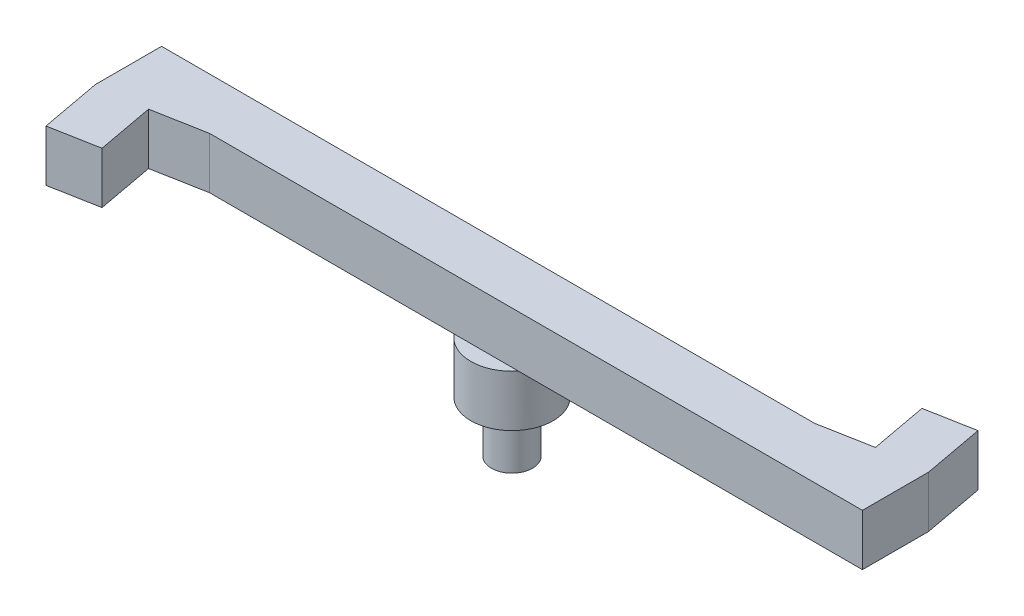
ISO-10303-21;
HEADER;
FILE_DESCRIPTION(('STEP AP214'),'2;1');
FILE_NAME('part.step','',(''),(''),'','','');
FILE_SCHEMA(('AUTOMOTIVE_DESIGN { 1 0 10303 214 1 1 1 1 }'));
ENDSEC;
DATA;
#1=APPLICATION_CONTEXT('core data for automotive mechanical design processes');
#2=APPLICATION_PROTOCOL_DEFINITION('international standard','automotive_design',2000,#1);
#3=PRODUCT_CONTEXT('',#1,'mechanical');
#4=PRODUCT('Part','Part','',(#3));
#5=PRODUCT_RELATED_PRODUCT_CATEGORY('part','',(#4));
#6=PRODUCT_DEFINITION_FORMATION('','',#4);
#7=PRODUCT_DEFINITION_CONTEXT('part definition',#1,'design');
#8=PRODUCT_DEFINITION('design','',#6,#7);
#9=PRODUCT_DEFINITION_SHAPE('','',#8);
#10=(LENGTH_UNIT() NAMED_UNIT(*) SI_UNIT(.MILLI.,.METRE.));
#11=(NAMED_UNIT(*) PLANE_ANGLE_UNIT() SI_UNIT($,.RADIAN.));
#12=(NAMED_UNIT(*) SI_UNIT($,.STERADIAN.) SOLID_ANGLE_UNIT());
#13=UNCERTAINTY_MEASURE_WITH_UNIT(LENGTH_MEASURE(1.E-05),#10,'distance_accuracy_value','');
#14=(GEOMETRIC_REPRESENTATION_CONTEXT(3) GLOBAL_UNCERTAINTY_ASSIGNED_CONTEXT((#13)) GLOBAL_UNIT_ASSIGNED_CONTEXT((#10,
#11,#12)) REPRESENTATION_CONTEXT('',''));
#15=CARTESIAN_POINT('',(0.,0.,0.));
#16=DIRECTION('',(0.,0.,1.));
#17=DIRECTION('',(1.,0.,0.));
#18=AXIS2_PLACEMENT_3D('',#15,#16,#17);
#19=CARTESIAN_POINT('',(0.,0.,0.));
#20=DIRECTION('',(0.,1.,0.));
#21=DIRECTION('',(0.,0.,1.));
#22=AXIS2_PLACEMENT_3D('',#19,#20,#21);
#23=PLANE('',#22);
#24=DIRECTION('',(1.,0.,0.));
#25=VECTOR('',#24,1.);
#26=CARTESIAN_POINT('',(0.,0.,3.175));
#27=LINE('',#26,#25);
#28=CARTESIAN_POINT('',(3.96557372898298,0.,3.175));
#29=VERTEX_POINT('',#28);
#30=CARTESIAN_POINT('',(46.4532077337979,0.,3.175));
#31=VERTEX_POINT('',#30);
#32=EDGE_CURVE('E145',#29,#31,#27,.T.);
#33=ORIENTED_EDGE('',*,*,#32,.F.);
#34=CARTESIAN_POINT('',(0.,0.,0.));
#35=DIRECTION('',(0.,1.,0.));
#36=DIRECTION('',(0.,0.,1.));
#37=AXIS2_PLACEMENT_3D('',#34,#35,#36);
#38=CIRCLE('',#37,5.08);
#39=CARTESIAN_POINT('',(3.96557372898298,0.,-3.175));
#40=VERTEX_POINT('',#39);
#41=EDGE_CURVE('E176',#29,#40,#38,.T.);
#42=ORIENTED_EDGE('',*,*,#41,.T.);
#43=DIRECTION('',(-1.,0.,0.));
#44=VECTOR('',#43,1.);
#45=CARTESIAN_POINT('',(0.,0.,-3.175));
#46=LINE('',#45,#44);
#47=CARTESIAN_POINT('',(34.18332,0.,-3.175));
#48=VERTEX_POINT('',#47);
#49=EDGE_CURVE('E143',#48,#40,#46,.T.);
#50=ORIENTED_EDGE('',*,*,#49,.F.);
#51=DIRECTION('',(0.983254907563956,0.,-0.182235525492141));
#52=VECTOR('',#51,1.);
#53=CARTESIAN_POINT('',(0.566311647751614,0.,3.05554422146091));
#54=LINE('',#53,#52);
#55=CARTESIAN_POINT('',(40.53332,0.,-4.35190293531521));
#56=VERTEX_POINT('',#55);
#57=EDGE_CURVE('E161',#48,#56,#54,.T.);
#58=ORIENTED_EDGE('',*,*,#57,.T.);
#59=DIRECTION('',(-0.182235525492142,0.,-0.983254907563956));
#60=VECTOR('',#59,1.);
#61=CARTESIAN_POINT('',(39.9670083522484,0.,-7.40744715677614));
#62=LINE('',#61,#60);
#63=CARTESIAN_POINT('',(39.2263116459843,0.,-11.4038889563856));
#64=VERTEX_POINT('',#63);
#65=EDGE_CURVE('E159',#56,#64,#62,.T.);
#66=ORIENTED_EDGE('',*,*,#65,.T.);
#67=DIRECTION('',(0.983254907563956,0.,-0.182235525492142));
#68=VECTOR('',#67,1.);
#69=CARTESIAN_POINT('',(-0.740696706264049,0.,-3.99644179960942));
#70=LINE('',#69,#68);
#71=CARTESIAN_POINT('',(45.0645730295477,0.,-12.4859467452758));
#72=VERTEX_POINT('',#71);
#73=EDGE_CURVE('E120',#64,#72,#70,.T.);
#74=ORIENTED_EDGE('',*,*,#73,.T.);
#75=DIRECTION('',(0.182235525492142,0.,0.983254907563956));
#76=VECTOR('',#75,1.);
#77=CARTESIAN_POINT('',(45.8052697358118,0.,-8.48950494566642));
#78=LINE('',#77,#76);
#79=CARTESIAN_POINT('',(46.4532077337979,0.,-4.99354434963848));
#80=VERTEX_POINT('',#79);
#81=EDGE_CURVE('E155',#72,#80,#78,.T.);
#82=ORIENTED_EDGE('',*,*,#81,.T.);
#83=DIRECTION('',(0.,0.,1.));
#84=VECTOR('',#83,1.);
#85=CARTESIAN_POINT('',(46.4532077337979,0.,0.));
#86=LINE('',#85,#84);
#87=EDGE_CURVE('E151',#80,#31,#86,.T.);
#88=ORIENTED_EDGE('',*,*,#87,.T.);
#89=EDGE_LOOP('',(#33,#42,#50,#58,#66,#74,#82,#88));
#90=FACE_BOUND('',#89,.T.);
#91=ADVANCED_FACE('F41',(#90),#23,.F.);
#92=CARTESIAN_POINT('',(0.,6.35,-3.175));
#93=DIRECTION('',(0.,0.,1.));
#94=DIRECTION('',(1.,0.,0.));
#95=AXIS2_PLACEMENT_3D('',#92,#93,#94);
#96=PLANE('',#95);
#97=ORIENTED_EDGE('',*,*,#49,.T.);
#98=CARTESIAN_POINT('',(-3.96557372898298,0.,-3.175));
#99=VERTEX_POINT('',#98);
#100=EDGE_CURVE('E146',#40,#99,#46,.T.);
#101=ORIENTED_EDGE('',*,*,#100,.T.);
#102=CARTESIAN_POINT('',(-46.4532077337979,0.,-3.175));
#103=VERTEX_POINT('',#102);
#104=EDGE_CURVE('E147',#99,#103,#46,.T.);
#105=ORIENTED_EDGE('',*,*,#104,.T.);
#106=DIRECTION('',(0.,-1.,0.));
#107=VECTOR('',#106,1.);
#108=CARTESIAN_POINT('',(-46.4532077337979,6.35,-3.175));
#109=LINE('',#108,#107);
#110=CARTESIAN_POINT('',(-46.4532077337979,6.35,-3.175));
#111=VERTEX_POINT('',#110);
#112=EDGE_CURVE('E237',#111,#103,#109,.T.);
#113=ORIENTED_EDGE('',*,*,#112,.F.);
#114=DIRECTION('',(-1.,0.,0.));
#115=VECTOR('',#114,1.);
#116=CARTESIAN_POINT('',(0.,6.35,-3.175));
#117=LINE('',#116,#115);
#118=CARTESIAN_POINT('',(34.18332,6.35,-3.175));
#119=VERTEX_POINT('',#118);
#120=EDGE_CURVE('E164',#119,#111,#117,.T.);
#121=ORIENTED_EDGE('',*,*,#120,.F.);
#122=DIRECTION('',(0.,-1.,0.));
#123=VECTOR('',#122,1.);
#124=CARTESIAN_POINT('',(34.18332,6.35,-3.175));
#125=LINE('',#124,#123);
#126=EDGE_CURVE('E67',#119,#48,#125,.T.);
#127=ORIENTED_EDGE('',*,*,#126,.T.);
#128=EDGE_LOOP('',(#97,#101,#105,#113,#121,#127));
#129=FACE_BOUND('',#128,.T.);
#130=ADVANCED_FACE('F43',(#129),#96,.F.);
#131=CARTESIAN_POINT('',(0.,6.35,3.175));
#132=DIRECTION('',(0.,0.,-1.));
#133=DIRECTION('',(-1.,0.,0.));
#134=AXIS2_PLACEMENT_3D('',#131,#132,#133);
#135=PLANE('',#134);
#136=CARTESIAN_POINT('',(-34.18332,0.,3.175));
#137=VERTEX_POINT('',#136);
#138=CARTESIAN_POINT('',(-3.96557372898298,0.,3.175));
#139=VERTEX_POINT('',#138);
#140=EDGE_CURVE('E148',#137,#139,#27,.T.);
#141=ORIENTED_EDGE('',*,*,#140,.T.);
#142=EDGE_CURVE('E152',#139,#29,#27,.T.);
#143=ORIENTED_EDGE('',*,*,#142,.T.);
#144=ORIENTED_EDGE('',*,*,#32,.T.);
#145=DIRECTION('',(0.,-1.,0.));
#146=VECTOR('',#145,1.);
#147=CARTESIAN_POINT('',(46.4532077337979,6.35,3.175));
#148=LINE('',#147,#146);
#149=CARTESIAN_POINT('',(46.4532077337979,6.35,3.175));
#150=VERTEX_POINT('',#149);
#151=EDGE_CURVE('E45',#150,#31,#148,.T.);
#152=ORIENTED_EDGE('',*,*,#151,.F.);
#153=DIRECTION('',(1.,0.,0.));
#154=VECTOR('',#153,1.);
#155=CARTESIAN_POINT('',(0.,6.35,3.175));
#156=LINE('',#155,#154);
#157=CARTESIAN_POINT('',(-34.18332,6.35,3.175));
#158=VERTEX_POINT('',#157);
#159=EDGE_CURVE('E101',#158,#150,#156,.T.);
#160=ORIENTED_EDGE('',*,*,#159,.F.);
#161=DIRECTION('',(0.,-1.,0.));
#162=VECTOR('',#161,1.);
#163=CARTESIAN_POINT('',(-34.18332,6.35,3.175));
#164=LINE('',#163,#162);
#165=EDGE_CURVE('E222',#158,#137,#164,.T.);
#166=ORIENTED_EDGE('',*,*,#165,.T.);
#167=EDGE_LOOP('',(#141,#143,#144,#152,#160,#166));
#168=FACE_BOUND('',#167,.T.);
#169=ADVANCED_FACE('F293',(#168),#135,.F.);
#170=CARTESIAN_POINT('',(46.4532077337979,6.35,0.));
#171=DIRECTION('',(1.,0.,0.));
#172=DIRECTION('',(0.,0.,-1.));
#173=AXIS2_PLACEMENT_3D('',#170,#171,#172);
#174=PLANE('',#173);
#175=ORIENTED_EDGE('',*,*,#87,.F.);
#176=DIRECTION('',(0.,-1.,0.));
#177=VECTOR('',#176,1.);
#178=CARTESIAN_POINT('',(46.4532077337979,6.35,-4.99354434963848));
#179=LINE('',#178,#177);
#180=CARTESIAN_POINT('',(46.4532077337979,6.35,-4.99354434963848));
#181=VERTEX_POINT('',#180);
#182=EDGE_CURVE('E167',#181,#80,#179,.T.);
#183=ORIENTED_EDGE('',*,*,#182,.F.);
#184=DIRECTION('',(0.,0.,1.));
#185=VECTOR('',#184,1.);
#186=CARTESIAN_POINT('',(46.4532077337979,6.35,0.));
#187=LINE('',#186,#185);
#188=EDGE_CURVE('E242',#181,#150,#187,.T.);
#189=ORIENTED_EDGE('',*,*,#188,.T.);
#190=ORIENTED_EDGE('',*,*,#151,.T.);
#191=EDGE_LOOP('',(#175,#183,#189,#190));
#192=FACE_BOUND('',#191,.T.);
#193=ADVANCED_FACE('F295',(#192),#174,.T.);
#194=CARTESIAN_POINT('',(45.8052697358118,6.35,-8.48950494566642));
#195=DIRECTION('',(0.983254907563955,0.,-0.182235525492142));
#196=DIRECTION('',(-0.182235525492142,0.,-0.983254907563956));
#197=AXIS2_PLACEMENT_3D('',#194,#195,#196);
#198=PLANE('',#197);
#199=ORIENTED_EDGE('',*,*,#81,.F.);
#200=DIRECTION('',(0.,-1.,0.));
#201=VECTOR('',#200,1.);
#202=CARTESIAN_POINT('',(45.0645730295477,6.35,-12.4859467452758));
#203=LINE('',#202,#201);
#204=CARTESIAN_POINT('',(45.0645730295477,6.35,-12.4859467452758));
#205=VERTEX_POINT('',#204);
#206=EDGE_CURVE('E125',#205,#72,#203,.T.);
#207=ORIENTED_EDGE('',*,*,#206,.F.);
#208=DIRECTION('',(0.182235525492142,0.,0.983254907563956));
#209=VECTOR('',#208,1.);
#210=CARTESIAN_POINT('',(45.8052697358118,6.35,-8.48950494566642));
#211=LINE('',#210,#209);
#212=EDGE_CURVE('E135',#205,#181,#211,.T.);
#213=ORIENTED_EDGE('',*,*,#212,.T.);
#214=ORIENTED_EDGE('',*,*,#182,.T.);
#215=EDGE_LOOP('',(#199,#207,#213,#214));
#216=FACE_BOUND('',#215,.T.);
#217=ADVANCED_FACE('F243',(#216),#198,.T.);
#218=CARTESIAN_POINT('',(-0.740696706264049,6.35,-3.99644179960942));
#219=DIRECTION('',(-0.182235525492142,0.,-0.983254907563956));
#220=DIRECTION('',(-0.983254907563956,0.,0.182235525492142));
#221=AXIS2_PLACEMENT_3D('',#218,#219,#220);
#222=PLANE('',#221);
#223=ORIENTED_EDGE('',*,*,#73,.F.);
#224=DIRECTION('',(0.,-1.,0.));
#225=VECTOR('',#224,1.);
#226=CARTESIAN_POINT('',(39.2263116459843,6.35,-11.4038889563856));
#227=LINE('',#226,#225);
#228=CARTESIAN_POINT('',(39.2263116459843,6.35,-11.4038889563856));
#229=VERTEX_POINT('',#228);
#230=EDGE_CURVE('E115',#229,#64,#227,.T.);
#231=ORIENTED_EDGE('',*,*,#230,.F.);
#232=DIRECTION('',(0.983254907563956,0.,-0.182235525492142));
#233=VECTOR('',#232,1.);
#234=CARTESIAN_POINT('',(-0.740696706264049,6.35,-3.99644179960942));
#235=LINE('',#234,#233);
#236=EDGE_CURVE('E118',#229,#205,#235,.T.);
#237=ORIENTED_EDGE('',*,*,#236,.T.);
#238=ORIENTED_EDGE('',*,*,#206,.T.);
#239=EDGE_LOOP('',(#223,#231,#237,#238));
#240=FACE_BOUND('',#239,.T.);
#241=ADVANCED_FACE('F117',(#240),#222,.T.);
#242=CARTESIAN_POINT('',(39.9670083522484,6.35,-7.40744715677614));
#243=DIRECTION('',(-0.983254907563956,0.,0.182235525492142));
#244=DIRECTION('',(0.182235525492142,0.,0.983254907563956));
#245=AXIS2_PLACEMENT_3D('',#242,#243,#244);
#246=PLANE('',#245);
#247=ORIENTED_EDGE('',*,*,#65,.F.);
#248=DIRECTION('',(0.,-1.,0.));
#249=VECTOR('',#248,1.);
#250=CARTESIAN_POINT('',(40.53332,6.35,-4.35190293531521));
#251=LINE('',#250,#249);
#252=CARTESIAN_POINT('',(40.53332,6.35,-4.35190293531521));
#253=VERTEX_POINT('',#252);
#254=EDGE_CURVE('E126',#253,#56,#251,.T.);
#255=ORIENTED_EDGE('',*,*,#254,.F.);
#256=DIRECTION('',(-0.182235525492142,0.,-0.983254907563956));
#257=VECTOR('',#256,1.);
#258=CARTESIAN_POINT('',(39.9670083522484,6.35,-7.40744715677614));
#259=LINE('',#258,#257);
#260=EDGE_CURVE('E133',#253,#229,#259,.T.);
#261=ORIENTED_EDGE('',*,*,#260,.T.);
#262=ORIENTED_EDGE('',*,*,#230,.T.);
#263=EDGE_LOOP('',(#247,#255,#261,#262));
#264=FACE_BOUND('',#263,.T.);
#265=ADVANCED_FACE('F137',(#264),#246,.T.);
#266=CARTESIAN_POINT('',(0.566311647751614,6.35,3.05554422146091));
#267=DIRECTION('',(-0.182235525492141,0.,-0.983254907563956));
#268=DIRECTION('',(-0.983254907563956,0.,0.182235525492141));
#269=AXIS2_PLACEMENT_3D('',#266,#267,#268);
#270=PLANE('',#269);
#271=ORIENTED_EDGE('',*,*,#57,.F.);
#272=ORIENTED_EDGE('',*,*,#126,.F.);
#273=DIRECTION('',(0.983254907563956,0.,-0.182235525492141));
#274=VECTOR('',#273,1.);
#275=CARTESIAN_POINT('',(0.566311647751614,6.35,3.05554422146091));
#276=LINE('',#275,#274);
#277=EDGE_CURVE('E138',#119,#253,#276,.T.);
#278=ORIENTED_EDGE('',*,*,#277,.T.);
#279=ORIENTED_EDGE('',*,*,#254,.T.);
#280=EDGE_LOOP('',(#271,#272,#278,#279));
#281=FACE_BOUND('',#280,.T.);
#282=ADVANCED_FACE('F246',(#281),#270,.T.);
#283=CARTESIAN_POINT('',(0.,6.35,0.));
#284=DIRECTION('',(0.,1.,0.));
#285=DIRECTION('',(0.,0.,1.));
#286=AXIS2_PLACEMENT_3D('',#283,#284,#285);
#287=PLANE('',#286);
#288=ORIENTED_EDGE('',*,*,#120,.T.);
#289=DIRECTION('',(0.,0.,-1.));
#290=VECTOR('',#289,1.);
#291=CARTESIAN_POINT('',(-46.4532077337979,6.35,0.));
#292=LINE('',#291,#290);
#293=CARTESIAN_POINT('',(-46.4532077337979,6.35,4.99354434963848));
#294=VERTEX_POINT('',#293);
#295=EDGE_CURVE('E221',#294,#111,#292,.T.);
#296=ORIENTED_EDGE('',*,*,#295,.F.);
#297=DIRECTION('',(-0.182235525492142,0.,-0.983254907563956));
#298=VECTOR('',#297,1.);
#299=CARTESIAN_POINT('',(-45.8052697358118,6.35,8.48950494566642));
#300=LINE('',#299,#298);
#301=CARTESIAN_POINT('',(-45.0645730295477,6.35,12.4859467452758));
#302=VERTEX_POINT('',#301);
#303=EDGE_CURVE('E260',#302,#294,#300,.T.);
#304=ORIENTED_EDGE('',*,*,#303,.F.);
#305=DIRECTION('',(-0.983254907563956,0.,0.182235525492142));
#306=VECTOR('',#305,1.);
#307=CARTESIAN_POINT('',(0.740696706264049,6.35,3.99644179960942));
#308=LINE('',#307,#306);
#309=CARTESIAN_POINT('',(-39.2263116459843,6.35,11.4038889563856));
#310=VERTEX_POINT('',#309);
#311=EDGE_CURVE('E261',#310,#302,#308,.T.);
#312=ORIENTED_EDGE('',*,*,#311,.F.);
#313=DIRECTION('',(0.182235525492142,0.,0.983254907563956));
#314=VECTOR('',#313,1.);
#315=CARTESIAN_POINT('',(-39.9670083522484,6.35,7.40744715677614));
#316=LINE('',#315,#314);
#317=CARTESIAN_POINT('',(-40.53332,6.35,4.35190293531521));
#318=VERTEX_POINT('',#317);
#319=EDGE_CURVE('E265',#318,#310,#316,.T.);
#320=ORIENTED_EDGE('',*,*,#319,.F.);
#321=DIRECTION('',(-0.983254907563956,0.,0.182235525492141));
#322=VECTOR('',#321,1.);
#323=CARTESIAN_POINT('',(-0.566311647751614,6.35,-3.05554422146091));
#324=LINE('',#323,#322);
#325=EDGE_CURVE('E210',#158,#318,#324,.T.);
#326=ORIENTED_EDGE('',*,*,#325,.F.);
#327=ORIENTED_EDGE('',*,*,#159,.T.);
#328=ORIENTED_EDGE('',*,*,#188,.F.);
#329=ORIENTED_EDGE('',*,*,#212,.F.);
#330=ORIENTED_EDGE('',*,*,#236,.F.);
#331=ORIENTED_EDGE('',*,*,#260,.F.);
#332=ORIENTED_EDGE('',*,*,#277,.F.);
#333=EDGE_LOOP('',(#288,#296,#304,#312,#320,#326,#327,#328,#329,#330,#331,#332));
#334=FACE_BOUND('',#333,.T.);
#335=ADVANCED_FACE('F131',(#334),#287,.T.);
#336=ORIENTED_EDGE('',*,*,#104,.F.);
#337=EDGE_CURVE('E50',#99,#139,#38,.T.);
#338=ORIENTED_EDGE('',*,*,#337,.T.);
#339=ORIENTED_EDGE('',*,*,#140,.F.);
#340=DIRECTION('',(-0.983254907563956,0.,0.182235525492141));
#341=VECTOR('',#340,1.);
#342=CARTESIAN_POINT('',(-0.566311647751614,0.,-3.05554422146091));
#343=LINE('',#342,#341);
#344=CARTESIAN_POINT('',(-40.53332,0.,4.35190293531521));
#345=VERTEX_POINT('',#344);
#346=EDGE_CURVE('E218',#137,#345,#343,.T.);
#347=ORIENTED_EDGE('',*,*,#346,.T.);
#348=DIRECTION('',(0.182235525492142,0.,0.983254907563956));
#349=VECTOR('',#348,1.);
#350=CARTESIAN_POINT('',(-39.9670083522484,0.,7.40744715677614));
#351=LINE('',#350,#349);
#352=CARTESIAN_POINT('',(-39.2263116459843,0.,11.4038889563856));
#353=VERTEX_POINT('',#352);
#354=EDGE_CURVE('E215',#345,#353,#351,.T.);
#355=ORIENTED_EDGE('',*,*,#354,.T.);
#356=DIRECTION('',(-0.983254907563956,0.,0.182235525492142));
#357=VECTOR('',#356,1.);
#358=CARTESIAN_POINT('',(0.740696706264049,0.,3.99644179960942));
#359=LINE('',#358,#357);
#360=CARTESIAN_POINT('',(-45.0645730295477,0.,12.4859467452758));
#361=VERTEX_POINT('',#360);
#362=EDGE_CURVE('E207',#353,#361,#359,.T.);
#363=ORIENTED_EDGE('',*,*,#362,.T.);
#364=DIRECTION('',(-0.182235525492142,0.,-0.983254907563956));
#365=VECTOR('',#364,1.);
#366=CARTESIAN_POINT('',(-45.8052697358118,0.,8.48950494566642));
#367=LINE('',#366,#365);
#368=CARTESIAN_POINT('',(-46.4532077337979,0.,4.99354434963848));
#369=VERTEX_POINT('',#368);
#370=EDGE_CURVE('E202',#361,#369,#367,.T.);
#371=ORIENTED_EDGE('',*,*,#370,.T.);
#372=DIRECTION('',(0.,0.,-1.));
#373=VECTOR('',#372,1.);
#374=CARTESIAN_POINT('',(-46.4532077337979,0.,0.));
#375=LINE('',#374,#373);
#376=EDGE_CURVE('E198',#369,#103,#375,.T.);
#377=ORIENTED_EDGE('',*,*,#376,.T.);
#378=EDGE_LOOP('',(#336,#338,#339,#347,#355,#363,#371,#377));
#379=FACE_BOUND('',#378,.T.);
#380=ADVANCED_FACE('F291',(#379),#23,.F.);
#381=CARTESIAN_POINT('',(-46.4532077337979,6.35,0.));
#382=DIRECTION('',(-1.,0.,0.));
#383=DIRECTION('',(0.,0.,1.));
#384=AXIS2_PLACEMENT_3D('',#381,#382,#383);
#385=PLANE('',#384);
#386=ORIENTED_EDGE('',*,*,#376,.F.);
#387=DIRECTION('',(0.,-1.,0.));
#388=VECTOR('',#387,1.);
#389=CARTESIAN_POINT('',(-46.4532077337979,6.35,4.99354434963848));
#390=LINE('',#389,#388);
#391=EDGE_CURVE('E234',#294,#369,#390,.T.);
#392=ORIENTED_EDGE('',*,*,#391,.F.);
#393=ORIENTED_EDGE('',*,*,#295,.T.);
#394=ORIENTED_EDGE('',*,*,#112,.T.);
#395=EDGE_LOOP('',(#386,#392,#393,#394));
#396=FACE_BOUND('',#395,.T.);
#397=ADVANCED_FACE('F259',(#396),#385,.T.);
#398=CARTESIAN_POINT('',(-45.8052697358118,6.35,8.48950494566642));
#399=DIRECTION('',(-0.983254907563955,0.,0.182235525492142));
#400=DIRECTION('',(0.182235525492142,0.,0.983254907563956));
#401=AXIS2_PLACEMENT_3D('',#398,#399,#400);
#402=PLANE('',#401);
#403=ORIENTED_EDGE('',*,*,#370,.F.);
#404=DIRECTION('',(0.,-1.,0.));
#405=VECTOR('',#404,1.);
#406=CARTESIAN_POINT('',(-45.0645730295477,6.35,12.4859467452758));
#407=LINE('',#406,#405);
#408=EDGE_CURVE('E231',#302,#361,#407,.T.);
#409=ORIENTED_EDGE('',*,*,#408,.F.);
#410=ORIENTED_EDGE('',*,*,#303,.T.);
#411=ORIENTED_EDGE('',*,*,#391,.T.);
#412=EDGE_LOOP('',(#403,#409,#410,#411));
#413=FACE_BOUND('',#412,.T.);
#414=ADVANCED_FACE('F312',(#413),#402,.T.);
#415=CARTESIAN_POINT('',(0.740696706264049,6.35,3.99644179960942));
#416=DIRECTION('',(0.182235525492142,0.,0.983254907563956));
#417=DIRECTION('',(0.983254907563956,0.,-0.182235525492142));
#418=AXIS2_PLACEMENT_3D('',#415,#416,#417);
#419=PLANE('',#418);
#420=ORIENTED_EDGE('',*,*,#362,.F.);
#421=DIRECTION('',(0.,-1.,0.));
#422=VECTOR('',#421,1.);
#423=CARTESIAN_POINT('',(-39.2263116459843,6.35,11.4038889563856));
#424=LINE('',#423,#422);
#425=EDGE_CURVE('E228',#310,#353,#424,.T.);
#426=ORIENTED_EDGE('',*,*,#425,.F.);
#427=ORIENTED_EDGE('',*,*,#311,.T.);
#428=ORIENTED_EDGE('',*,*,#408,.T.);
#429=EDGE_LOOP('',(#420,#426,#427,#428));
#430=FACE_BOUND('',#429,.T.);
#431=ADVANCED_FACE('F320',(#430),#419,.T.);
#432=CARTESIAN_POINT('',(-39.9670083522484,6.35,7.40744715677614));
#433=DIRECTION('',(0.983254907563956,0.,-0.182235525492142));
#434=DIRECTION('',(-0.182235525492142,0.,-0.983254907563956));
#435=AXIS2_PLACEMENT_3D('',#432,#433,#434);
#436=PLANE('',#435);
#437=ORIENTED_EDGE('',*,*,#354,.F.);
#438=DIRECTION('',(0.,-1.,0.));
#439=VECTOR('',#438,1.);
#440=CARTESIAN_POINT('',(-40.53332,6.35,4.35190293531521));
#441=LINE('',#440,#439);
#442=EDGE_CURVE('E225',#318,#345,#441,.T.);
#443=ORIENTED_EDGE('',*,*,#442,.F.);
#444=ORIENTED_EDGE('',*,*,#319,.T.);
#445=ORIENTED_EDGE('',*,*,#425,.T.);
#446=EDGE_LOOP('',(#437,#443,#444,#445));
#447=FACE_BOUND('',#446,.T.);
#448=ADVANCED_FACE('F324',(#447),#436,.T.);
#449=CARTESIAN_POINT('',(-0.566311647751614,6.35,-3.05554422146091));
#450=DIRECTION('',(0.182235525492141,0.,0.983254907563956));
#451=DIRECTION('',(0.983254907563956,0.,-0.182235525492141));
#452=AXIS2_PLACEMENT_3D('',#449,#450,#451);
#453=PLANE('',#452);
#454=ORIENTED_EDGE('',*,*,#346,.F.);
#455=ORIENTED_EDGE('',*,*,#165,.F.);
#456=ORIENTED_EDGE('',*,*,#325,.T.);
#457=ORIENTED_EDGE('',*,*,#442,.T.);
#458=EDGE_LOOP('',(#454,#455,#456,#457));
#459=FACE_BOUND('',#458,.T.);
#460=ADVANCED_FACE('F276',(#459),#453,.T.);
#461=CARTESIAN_POINT('',(0.,0.,0.));
#462=DIRECTION('',(0.,1.,0.));
#463=DIRECTION('',(0.,0.,1.));
#464=AXIS2_PLACEMENT_3D('',#461,#462,#463);
#465=PLANE('',#464);
#466=ORIENTED_EDGE('',*,*,#100,.F.);
#467=EDGE_CURVE('E177',#40,#99,#38,.T.);
#468=ORIENTED_EDGE('',*,*,#467,.T.);
#469=EDGE_LOOP('',(#466,#468));
#470=FACE_BOUND('',#469,.T.);
#471=ADVANCED_FACE('F330',(#470),#465,.T.);
#472=ORIENTED_EDGE('',*,*,#142,.F.);
#473=EDGE_CURVE('E58',#139,#29,#38,.T.);
#474=ORIENTED_EDGE('',*,*,#473,.T.);
#475=EDGE_LOOP('',(#472,#474));
#476=FACE_BOUND('',#475,.T.);
#477=ADVANCED_FACE('F335',(#476),#465,.T.);
#478=CARTESIAN_POINT('',(0.,-6.35,0.));
#479=DIRECTION('',(0.,1.,0.));
#480=DIRECTION('',(0.,0.,1.));
#481=AXIS2_PLACEMENT_3D('',#478,#479,#480);
#482=CYLINDRICAL_SURFACE('',#481,5.08);
#483=CARTESIAN_POINT('',(0.,-6.35,0.));
#484=DIRECTION('',(0.,1.,0.));
#485=DIRECTION('',(0.,0.,1.));
#486=AXIS2_PLACEMENT_3D('',#483,#484,#485);
#487=CIRCLE('',#486,5.08);
#488=CARTESIAN_POINT('',(0.,-6.35,5.08));
#489=VERTEX_POINT('',#488);
#490=EDGE_CURVE('E184',#489,#489,#487,.T.);
#491=ORIENTED_EDGE('',*,*,#490,.T.);
#492=EDGE_LOOP('',(#491));
#493=FACE_BOUND('',#492,.T.);
#494=ORIENTED_EDGE('',*,*,#41,.F.);
#495=ORIENTED_EDGE('',*,*,#473,.F.);
#496=ORIENTED_EDGE('',*,*,#337,.F.);
#497=ORIENTED_EDGE('',*,*,#467,.F.);
#498=EDGE_LOOP('',(#494,#495,#496,#497));
#499=FACE_BOUND('',#498,.T.);
#500=ADVANCED_FACE('F331',(#493,#499),#482,.T.);
#501=CARTESIAN_POINT('',(0.,-6.35,0.));
#502=DIRECTION('',(0.,1.,0.));
#503=DIRECTION('',(0.,0.,1.));
#504=AXIS2_PLACEMENT_3D('',#501,#502,#503);
#505=PLANE('',#504);
#506=CARTESIAN_POINT('',(0.,-6.35,0.));
#507=DIRECTION('',(0.,-1.,0.));
#508=DIRECTION('',(0.,0.,-1.));
#509=AXIS2_PLACEMENT_3D('',#506,#507,#508);
#510=CIRCLE('',#509,2.54);
#511=CARTESIAN_POINT('',(0.,-6.35,-2.54));
#512=VERTEX_POINT('',#511);
#513=EDGE_CURVE('E11',#512,#512,#510,.T.);
#514=ORIENTED_EDGE('',*,*,#513,.F.);
#515=EDGE_LOOP('',(#514));
#516=FACE_BOUND('',#515,.T.);
#517=ORIENTED_EDGE('',*,*,#490,.F.);
#518=EDGE_LOOP('',(#517));
#519=FACE_BOUND('',#518,.T.);
#520=ADVANCED_FACE('F334',(#516,#519),#505,.F.);
#521=CARTESIAN_POINT('',(0.,-12.7,0.));
#522=DIRECTION('',(0.,1.,0.));
#523=DIRECTION('',(0.,0.,1.));
#524=AXIS2_PLACEMENT_3D('',#521,#522,#523);
#525=CYLINDRICAL_SURFACE('',#524,2.54);
#526=CARTESIAN_POINT('',(0.,-12.7,0.));
#527=DIRECTION('',(0.,-1.,0.));
#528=DIRECTION('',(0.,0.,-1.));
#529=AXIS2_PLACEMENT_3D('',#526,#527,#528);
#530=CIRCLE('',#529,2.54);
#531=CARTESIAN_POINT('',(0.,-12.7,-2.54));
#532=VERTEX_POINT('',#531);
#533=EDGE_CURVE('E190',#532,#532,#530,.T.);
#534=ORIENTED_EDGE('',*,*,#533,.F.);
#535=EDGE_LOOP('',(#534));
#536=FACE_BOUND('',#535,.T.);
#537=ORIENTED_EDGE('',*,*,#513,.T.);
#538=EDGE_LOOP('',(#537));
#539=FACE_BOUND('',#538,.T.);
#540=ADVANCED_FACE('F340',(#536,#539),#525,.T.);
#541=CARTESIAN_POINT('',(0.,-12.7,0.));
#542=DIRECTION('',(0.,-1.,0.));
#543=DIRECTION('',(0.,0.,-1.));
#544=AXIS2_PLACEMENT_3D('',#541,#542,#543);
#545=PLANE('',#544);
#546=ORIENTED_EDGE('',*,*,#533,.T.);
#547=EDGE_LOOP('',(#546));
#548=FACE_BOUND('',#547,.T.);
#549=ADVANCED_FACE('F344',(#548),#545,.T.);
#550=CLOSED_SHELL('',(#91,#130,#169,#193,#217,#241,#265,#282,#335,#380,#397,#414,#431,#448,#460,
#471,#477,#500,#520,#540,#549));
#551=MANIFOLD_SOLID_BREP('B2',#550);
#552=ADVANCED_BREP_SHAPE_REPRESENTATION('',(#18,#551),#14);
#553=SHAPE_DEFINITION_REPRESENTATION(#9,#552);
ENDSEC;
END-ISO-10303-21;
